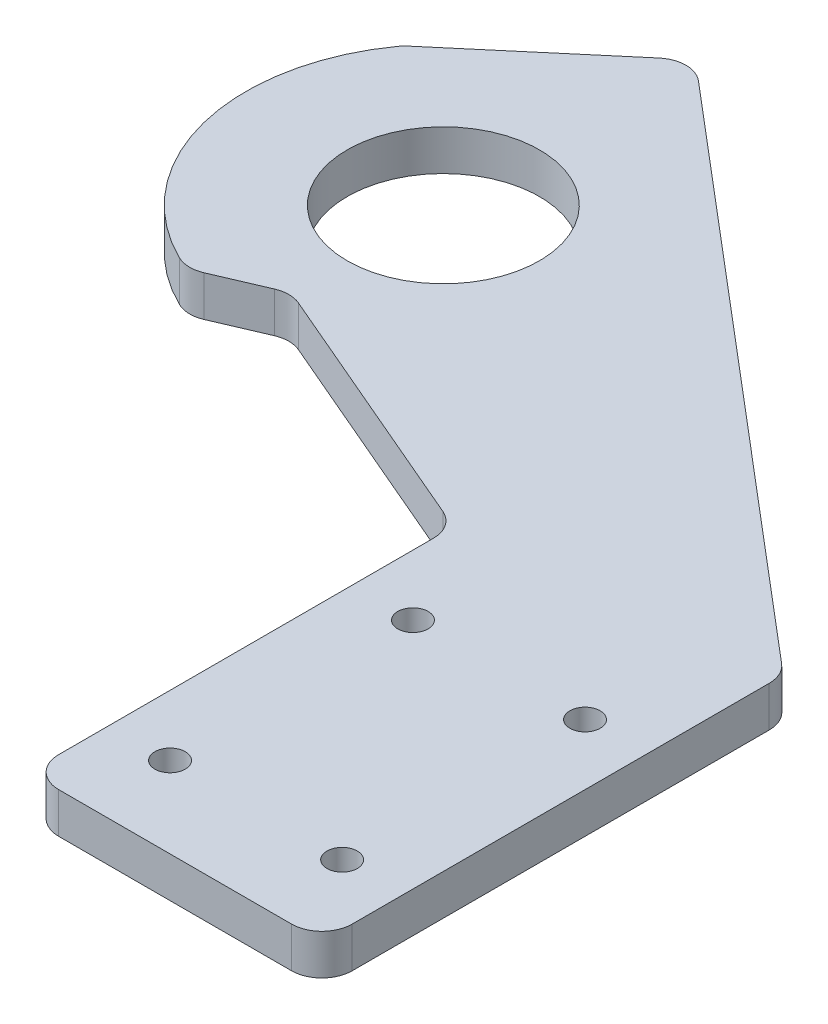
ISO-10303-21;
HEADER;
FILE_DESCRIPTION(('STEP AP214'),'2;1');
FILE_NAME('part.step','',(''),(''),'','','');
FILE_SCHEMA(('AUTOMOTIVE_DESIGN { 1 0 10303 214 1 1 1 1 }'));
ENDSEC;
DATA;
#1=APPLICATION_CONTEXT('core data for automotive mechanical design processes');
#2=APPLICATION_PROTOCOL_DEFINITION('international standard','automotive_design',2000,#1);
#3=PRODUCT_CONTEXT('',#1,'mechanical');
#4=PRODUCT('Part','Part','',(#3));
#5=PRODUCT_RELATED_PRODUCT_CATEGORY('part','',(#4));
#6=PRODUCT_DEFINITION_FORMATION('','',#4);
#7=PRODUCT_DEFINITION_CONTEXT('part definition',#1,'design');
#8=PRODUCT_DEFINITION('design','',#6,#7);
#9=PRODUCT_DEFINITION_SHAPE('','',#8);
#10=(LENGTH_UNIT() NAMED_UNIT(*) SI_UNIT(.MILLI.,.METRE.));
#11=(NAMED_UNIT(*) PLANE_ANGLE_UNIT() SI_UNIT($,.RADIAN.));
#12=(NAMED_UNIT(*) SI_UNIT($,.STERADIAN.) SOLID_ANGLE_UNIT());
#13=UNCERTAINTY_MEASURE_WITH_UNIT(LENGTH_MEASURE(1.E-05),#10,'distance_accuracy_value','');
#14=(GEOMETRIC_REPRESENTATION_CONTEXT(3) GLOBAL_UNCERTAINTY_ASSIGNED_CONTEXT((#13)) GLOBAL_UNIT_ASSIGNED_CONTEXT((#10,
#11,#12)) REPRESENTATION_CONTEXT('',''));
#15=CARTESIAN_POINT('',(0.,0.,0.));
#16=DIRECTION('',(0.,0.,1.));
#17=DIRECTION('',(1.,0.,0.));
#18=AXIS2_PLACEMENT_3D('',#15,#16,#17);
#19=CARTESIAN_POINT('',(12.,4.,-42.));
#20=DIRECTION('',(-0.393919298579168,0.,-0.919145030018058));
#21=DIRECTION('',(-0.919145030018058,0.,0.393919298579168));
#22=AXIS2_PLACEMENT_3D('',#19,#20,#21);
#23=PLANE('',#22);
#24=DIRECTION('',(0.919145030018058,0.,-0.393919298579168));
#25=VECTOR('',#24,1.);
#26=CARTESIAN_POINT('',(12.,4.,-42.));
#27=LINE('',#26,#25);
#28=CARTESIAN_POINT('',(33.9550810294325,4.,-51.4093204411854));
#29=VERTEX_POINT('',#28);
#30=CARTESIAN_POINT('',(38.8182421042625,4.,-53.4935323303982));
#31=VERTEX_POINT('',#30);
#32=EDGE_CURVE('E254',#29,#31,#27,.T.);
#33=ORIENTED_EDGE('',*,*,#32,.F.);
#34=DIRECTION('',(0.,-1.,0.));
#35=VECTOR('',#34,1.);
#36=CARTESIAN_POINT('',(33.9550810294325,0.,-51.4093204411854));
#37=LINE('',#36,#35);
#38=CARTESIAN_POINT('',(33.9550810294325,0.,-51.4093204411854));
#39=VERTEX_POINT('',#38);
#40=EDGE_CURVE('E202',#29,#39,#37,.T.);
#41=ORIENTED_EDGE('',*,*,#40,.T.);
#42=DIRECTION('',(0.919145030018058,0.,-0.393919298579168));
#43=VECTOR('',#42,1.);
#44=CARTESIAN_POINT('',(12.,0.,-42.));
#45=LINE('',#44,#43);
#46=CARTESIAN_POINT('',(38.8182421042625,0.,-53.4935323303982));
#47=VERTEX_POINT('',#46);
#48=EDGE_CURVE('E364',#39,#47,#45,.T.);
#49=ORIENTED_EDGE('',*,*,#48,.T.);
#50=DIRECTION('',(0.,-1.,0.));
#51=VECTOR('',#50,1.);
#52=CARTESIAN_POINT('',(38.8182421042625,4.,-53.4935323303982));
#53=LINE('',#52,#51);
#54=EDGE_CURVE('E196',#47,#31,#53,.F.);
#55=ORIENTED_EDGE('',*,*,#54,.T.);
#56=EDGE_LOOP('',(#33,#41,#49,#55));
#57=FACE_BOUND('',#56,.T.);
#58=ADVANCED_FACE('F43',(#57),#23,.F.);
#59=CARTESIAN_POINT('',(0.,4.,0.));
#60=DIRECTION('',(0.,-1.,0.));
#61=DIRECTION('',(0.,0.,-1.));
#62=AXIS2_PLACEMENT_3D('',#59,#60,#61);
#63=PLANE('',#62);
#64=CARTESIAN_POINT('',(40.,4.,-69.));
#65=DIRECTION('',(0.,1.,0.));
#66=DIRECTION('',(0.,0.,1.));
#67=AXIS2_PLACEMENT_3D('',#64,#65,#66);
#68=CIRCLE('',#67,19.5);
#69=CARTESIAN_POINT('',(24.1387597020295,4.,-80.343326505485));
#70=VERTEX_POINT('',#69);
#71=CARTESIAN_POINT('',(31.459381885276,4.,-51.4698019914649));
#72=VERTEX_POINT('',#71);
#73=EDGE_CURVE('E160',#70,#72,#68,.T.);
#74=ORIENTED_EDGE('',*,*,#73,.T.);
#75=CARTESIAN_POINT('',(32.773323133695,4.,-54.1667555312396));
#76=DIRECTION('',(0.,-1.,0.));
#77=DIRECTION('',(0.,0.,-1.));
#78=AXIS2_PLACEMENT_3D('',#75,#76,#77);
#79=CIRCLE('',#78,3.);
#80=EDGE_CURVE('E197',#72,#29,#79,.F.);
#81=ORIENTED_EDGE('',*,*,#80,.T.);
#82=ORIENTED_EDGE('',*,*,#32,.T.);
#83=CARTESIAN_POINT('',(40.,4.,-50.736097240344));
#84=DIRECTION('',(0.,-1.,0.));
#85=DIRECTION('',(0.,0.,-1.));
#86=AXIS2_PLACEMENT_3D('',#83,#84,#85);
#87=CIRCLE('',#86,3.);
#88=CARTESIAN_POINT('',(41.1817578957375,4.,-53.4935323303982));
#89=VERTEX_POINT('',#88);
#90=EDGE_CURVE('E244',#31,#89,#87,.T.);
#91=ORIENTED_EDGE('',*,*,#90,.T.);
#92=DIRECTION('',(0.919145030018058,0.,0.393919298579168));
#93=VECTOR('',#92,1.);
#94=CARTESIAN_POINT('',(40.,4.,-54.));
#95=LINE('',#94,#93);
#96=CARTESIAN_POINT('',(66.1817578957375,4.,-42.7792466161125));
#97=VERTEX_POINT('',#96);
#98=EDGE_CURVE('E249',#89,#97,#95,.T.);
#99=ORIENTED_EDGE('',*,*,#98,.T.);
#100=CARTESIAN_POINT('',(65.,4.,-40.0218115260583));
#101=DIRECTION('',(0.,-1.,0.));
#102=DIRECTION('',(0.,0.,-1.));
#103=AXIS2_PLACEMENT_3D('',#100,#101,#102);
#104=CIRCLE('',#103,3.);
#105=CARTESIAN_POINT('',(68.,4.,-40.0218115260583));
#106=VERTEX_POINT('',#105);
#107=EDGE_CURVE('E11',#97,#106,#104,.T.);
#108=ORIENTED_EDGE('',*,*,#107,.T.);
#109=DIRECTION('',(0.,0.,1.));
#110=VECTOR('',#109,1.);
#111=CARTESIAN_POINT('',(68.,4.,0.));
#112=LINE('',#111,#110);
#113=CARTESIAN_POINT('',(68.,4.,-3.00000000000001));
#114=VERTEX_POINT('',#113);
#115=EDGE_CURVE('E256',#106,#114,#112,.T.);
#116=ORIENTED_EDGE('',*,*,#115,.T.);
#117=CARTESIAN_POINT('',(71.,4.,-3.00000000000001));
#118=DIRECTION('',(0.,-1.,0.));
#119=DIRECTION('',(0.,0.,-1.));
#120=AXIS2_PLACEMENT_3D('',#117,#118,#119);
#121=CIRCLE('',#120,3.);
#122=CARTESIAN_POINT('',(71.,4.,0.));
#123=VERTEX_POINT('',#122);
#124=EDGE_CURVE('E198',#114,#123,#121,.F.);
#125=ORIENTED_EDGE('',*,*,#124,.T.);
#126=DIRECTION('',(1.,0.,0.));
#127=VECTOR('',#126,1.);
#128=CARTESIAN_POINT('',(80.,4.,0.));
#129=LINE('',#128,#127);
#130=CARTESIAN_POINT('',(94.,4.,0.));
#131=VERTEX_POINT('',#130);
#132=EDGE_CURVE('E369',#123,#131,#129,.T.);
#133=ORIENTED_EDGE('',*,*,#132,.T.);
#134=CARTESIAN_POINT('',(94.,4.,-3.00000000000001));
#135=DIRECTION('',(0.,-1.,0.));
#136=DIRECTION('',(0.,0.,-1.));
#137=AXIS2_PLACEMENT_3D('',#134,#135,#136);
#138=CIRCLE('',#137,3.);
#139=CARTESIAN_POINT('',(97.,4.,-3.00000000000001));
#140=VERTEX_POINT('',#139);
#141=EDGE_CURVE('E193',#131,#140,#138,.F.);
#142=ORIENTED_EDGE('',*,*,#141,.T.);
#143=DIRECTION('',(0.,0.,1.));
#144=VECTOR('',#143,1.);
#145=CARTESIAN_POINT('',(97.,4.,0.));
#146=LINE('',#145,#144);
#147=CARTESIAN_POINT('',(97.,4.,-44.1992926229382));
#148=VERTEX_POINT('',#147);
#149=EDGE_CURVE('E407',#148,#140,#146,.T.);
#150=ORIENTED_EDGE('',*,*,#149,.F.);
#151=CARTESIAN_POINT('',(94.,4.,-44.1992926229382));
#152=DIRECTION('',(0.,-1.,0.));
#153=DIRECTION('',(0.,0.,-1.));
#154=AXIS2_PLACEMENT_3D('',#151,#152,#153);
#155=CIRCLE('',#154,3.);
#156=CARTESIAN_POINT('',(95.9398921562924,4.,-46.4877022064601));
#157=VERTEX_POINT('',#156);
#158=EDGE_CURVE('E166',#148,#157,#155,.F.);
#159=ORIENTED_EDGE('',*,*,#158,.T.);
#160=DIRECTION('',(-0.762803194507315,0.,-0.646630718764146));
#161=VECTOR('',#160,1.);
#162=CARTESIAN_POINT('',(40.,4.,-93.9081285144222));
#163=LINE('',#162,#161);
#164=CARTESIAN_POINT('',(41.9398921562924,4.,-92.2636757009301));
#165=VERTEX_POINT('',#164);
#166=EDGE_CURVE('E187',#157,#165,#163,.T.);
#167=ORIENTED_EDGE('',*,*,#166,.T.);
#168=CARTESIAN_POINT('',(40.,4.,-89.9752661174082));
#169=DIRECTION('',(0.,-1.,0.));
#170=DIRECTION('',(0.,0.,-1.));
#171=AXIS2_PLACEMENT_3D('',#168,#169,#170);
#172=CIRCLE('',#171,3.);
#173=CARTESIAN_POINT('',(38.0601078437076,4.,-92.2636757009301));
#174=VERTEX_POINT('',#173);
#175=EDGE_CURVE('E170',#165,#174,#172,.F.);
#176=ORIENTED_EDGE('',*,*,#175,.T.);
#177=DIRECTION('',(-0.762803194507315,0.,0.646630718764146));
#178=VECTOR('',#177,1.);
#179=CARTESIAN_POINT('',(0.,4.,-60.));
#180=LINE('',#179,#178);
#181=CARTESIAN_POINT('',(24.6390583608095,4.,-80.8866089343169));
#182=VERTEX_POINT('',#181);
#183=EDGE_CURVE('E162',#174,#182,#180,.T.);
#184=ORIENTED_EDGE('',*,*,#183,.T.);
#185=CARTESIAN_POINT('',(26.5789505171019,4.,-78.598199350795));
#186=DIRECTION('',(0.,-1.,0.));
#187=DIRECTION('',(0.,0.,-1.));
#188=AXIS2_PLACEMENT_3D('',#185,#186,#187);
#189=CIRCLE('',#188,3.);
#190=EDGE_CURVE('E156',#182,#70,#189,.F.);
#191=ORIENTED_EDGE('',*,*,#190,.T.);
#192=EDGE_LOOP('',(#74,#81,#82,#91,#99,#108,#116,#125,#133,#142,#150,#159,#167,#176,#184,#191));
#193=FACE_BOUND('',#192,.T.);
#194=CARTESIAN_POINT('',(74.,4.,-8.));
#195=DIRECTION('',(0.,1.,0.));
#196=DIRECTION('',(0.,0.,-1.));
#197=AXIS2_PLACEMENT_3D('',#194,#195,#196);
#198=CIRCLE('',#197,1.50000000000001);
#199=CARTESIAN_POINT('',(74.,4.,-9.50000000000001));
#200=VERTEX_POINT('',#199);
#201=EDGE_CURVE('E363',#200,#200,#198,.T.);
#202=ORIENTED_EDGE('',*,*,#201,.F.);
#203=EDGE_LOOP('',(#202));
#204=FACE_BOUND('',#203,.T.);
#205=CARTESIAN_POINT('',(40.,4.,-69.));
#206=DIRECTION('',(0.,1.,0.));
#207=DIRECTION('',(0.,0.,1.));
#208=AXIS2_PLACEMENT_3D('',#205,#206,#207);
#209=CIRCLE('',#208,9.50000000000001);
#210=CARTESIAN_POINT('',(40.,4.,-59.5));
#211=VERTEX_POINT('',#210);
#212=EDGE_CURVE('E355',#211,#211,#209,.T.);
#213=ORIENTED_EDGE('',*,*,#212,.F.);
#214=EDGE_LOOP('',(#213));
#215=FACE_BOUND('',#214,.T.);
#216=CARTESIAN_POINT('',(74.,4.,-32.));
#217=DIRECTION('',(0.,1.,0.));
#218=DIRECTION('',(0.,0.,-1.));
#219=AXIS2_PLACEMENT_3D('',#216,#217,#218);
#220=CIRCLE('',#219,1.50000000000001);
#221=CARTESIAN_POINT('',(74.,4.,-33.5));
#222=VERTEX_POINT('',#221);
#223=EDGE_CURVE('E350',#222,#222,#220,.T.);
#224=ORIENTED_EDGE('',*,*,#223,.F.);
#225=EDGE_LOOP('',(#224));
#226=FACE_BOUND('',#225,.T.);
#227=CARTESIAN_POINT('',(91.,4.,-8.));
#228=DIRECTION('',(0.,1.,0.));
#229=DIRECTION('',(0.,0.,1.));
#230=AXIS2_PLACEMENT_3D('',#227,#228,#229);
#231=CIRCLE('',#230,1.50000000000001);
#232=CARTESIAN_POINT('',(91.,4.,-6.49999999999999));
#233=VERTEX_POINT('',#232);
#234=EDGE_CURVE('E345',#233,#233,#231,.T.);
#235=ORIENTED_EDGE('',*,*,#234,.F.);
#236=EDGE_LOOP('',(#235));
#237=FACE_BOUND('',#236,.T.);
#238=CARTESIAN_POINT('',(91.,4.,-32.));
#239=DIRECTION('',(0.,1.,0.));
#240=DIRECTION('',(0.,0.,1.));
#241=AXIS2_PLACEMENT_3D('',#238,#239,#240);
#242=CIRCLE('',#241,1.50000000000001);
#243=CARTESIAN_POINT('',(91.,4.,-30.5));
#244=VERTEX_POINT('',#243);
#245=EDGE_CURVE('E332',#244,#244,#242,.T.);
#246=ORIENTED_EDGE('',*,*,#245,.F.);
#247=EDGE_LOOP('',(#246));
#248=FACE_BOUND('',#247,.T.);
#249=ADVANCED_FACE('F159',(#193,#204,#215,#226,#237,#248),#63,.F.);
#250=CARTESIAN_POINT('',(0.,0.,0.));
#251=DIRECTION('',(0.,-1.,0.));
#252=DIRECTION('',(0.,0.,-1.));
#253=AXIS2_PLACEMENT_3D('',#250,#251,#252);
#254=PLANE('',#253);
#255=ORIENTED_EDGE('',*,*,#48,.F.);
#256=CARTESIAN_POINT('',(32.773323133695,0.,-54.1667555312396));
#257=DIRECTION('',(0.,-1.,0.));
#258=DIRECTION('',(0.,0.,-1.));
#259=AXIS2_PLACEMENT_3D('',#256,#257,#258);
#260=CIRCLE('',#259,3.);
#261=CARTESIAN_POINT('',(31.459381885276,0.,-51.4698019914649));
#262=VERTEX_POINT('',#261);
#263=EDGE_CURVE('E215',#39,#262,#260,.T.);
#264=ORIENTED_EDGE('',*,*,#263,.T.);
#265=CARTESIAN_POINT('',(40.,0.,-69.));
#266=DIRECTION('',(0.,1.,0.));
#267=DIRECTION('',(0.,0.,1.));
#268=AXIS2_PLACEMENT_3D('',#265,#266,#267);
#269=CIRCLE('',#268,19.5);
#270=CARTESIAN_POINT('',(24.1387597020295,0.,-80.343326505485));
#271=VERTEX_POINT('',#270);
#272=EDGE_CURVE('E178',#271,#262,#269,.T.);
#273=ORIENTED_EDGE('',*,*,#272,.F.);
#274=CARTESIAN_POINT('',(26.5789505171019,0.,-78.598199350795));
#275=DIRECTION('',(0.,-1.,0.));
#276=DIRECTION('',(0.,0.,-1.));
#277=AXIS2_PLACEMENT_3D('',#274,#275,#276);
#278=CIRCLE('',#277,3.);
#279=CARTESIAN_POINT('',(24.6390583608095,0.,-80.8866089343169));
#280=VERTEX_POINT('',#279);
#281=EDGE_CURVE('E182',#271,#280,#278,.T.);
#282=ORIENTED_EDGE('',*,*,#281,.T.);
#283=DIRECTION('',(-0.762803194507315,0.,0.646630718764146));
#284=VECTOR('',#283,1.);
#285=CARTESIAN_POINT('',(0.,0.,-60.));
#286=LINE('',#285,#284);
#287=CARTESIAN_POINT('',(38.0601078437076,0.,-92.2636757009301));
#288=VERTEX_POINT('',#287);
#289=EDGE_CURVE('E186',#288,#280,#286,.T.);
#290=ORIENTED_EDGE('',*,*,#289,.F.);
#291=CARTESIAN_POINT('',(40.,0.,-89.9752661174082));
#292=DIRECTION('',(0.,-1.,0.));
#293=DIRECTION('',(0.,0.,-1.));
#294=AXIS2_PLACEMENT_3D('',#291,#292,#293);
#295=CIRCLE('',#294,3.);
#296=CARTESIAN_POINT('',(41.9398921562924,0.,-92.2636757009301));
#297=VERTEX_POINT('',#296);
#298=EDGE_CURVE('E210',#288,#297,#295,.T.);
#299=ORIENTED_EDGE('',*,*,#298,.T.);
#300=DIRECTION('',(-0.762803194507315,0.,-0.646630718764146));
#301=VECTOR('',#300,1.);
#302=CARTESIAN_POINT('',(40.,0.,-93.9081285144222));
#303=LINE('',#302,#301);
#304=CARTESIAN_POINT('',(95.9398921562924,0.,-46.4877022064601));
#305=VERTEX_POINT('',#304);
#306=EDGE_CURVE('E381',#305,#297,#303,.T.);
#307=ORIENTED_EDGE('',*,*,#306,.F.);
#308=CARTESIAN_POINT('',(94.,0.,-44.1992926229382));
#309=DIRECTION('',(0.,-1.,0.));
#310=DIRECTION('',(0.,0.,-1.));
#311=AXIS2_PLACEMENT_3D('',#308,#309,#310);
#312=CIRCLE('',#311,3.);
#313=CARTESIAN_POINT('',(97.,0.,-44.1992926229382));
#314=VERTEX_POINT('',#313);
#315=EDGE_CURVE('E203',#305,#314,#312,.T.);
#316=ORIENTED_EDGE('',*,*,#315,.T.);
#317=DIRECTION('',(0.,0.,1.));
#318=VECTOR('',#317,1.);
#319=CARTESIAN_POINT('',(97.,0.,0.));
#320=LINE('',#319,#318);
#321=CARTESIAN_POINT('',(97.,0.,-3.00000000000001));
#322=VERTEX_POINT('',#321);
#323=EDGE_CURVE('E337',#314,#322,#320,.T.);
#324=ORIENTED_EDGE('',*,*,#323,.T.);
#325=CARTESIAN_POINT('',(94.,0.,-3.00000000000001));
#326=DIRECTION('',(0.,-1.,0.));
#327=DIRECTION('',(0.,0.,-1.));
#328=AXIS2_PLACEMENT_3D('',#325,#326,#327);
#329=CIRCLE('',#328,3.);
#330=CARTESIAN_POINT('',(94.,0.,0.));
#331=VERTEX_POINT('',#330);
#332=EDGE_CURVE('E209',#322,#331,#329,.T.);
#333=ORIENTED_EDGE('',*,*,#332,.T.);
#334=DIRECTION('',(1.,0.,0.));
#335=VECTOR('',#334,1.);
#336=CARTESIAN_POINT('',(80.,0.,0.));
#337=LINE('',#336,#335);
#338=CARTESIAN_POINT('',(71.,0.,0.));
#339=VERTEX_POINT('',#338);
#340=EDGE_CURVE('E385',#339,#331,#337,.T.);
#341=ORIENTED_EDGE('',*,*,#340,.F.);
#342=CARTESIAN_POINT('',(71.,0.,-3.00000000000001));
#343=DIRECTION('',(0.,-1.,0.));
#344=DIRECTION('',(0.,0.,-1.));
#345=AXIS2_PLACEMENT_3D('',#342,#343,#344);
#346=CIRCLE('',#345,3.);
#347=CARTESIAN_POINT('',(68.,0.,-3.00000000000001));
#348=VERTEX_POINT('',#347);
#349=EDGE_CURVE('E214',#339,#348,#346,.T.);
#350=ORIENTED_EDGE('',*,*,#349,.T.);
#351=DIRECTION('',(0.,0.,1.));
#352=VECTOR('',#351,1.);
#353=CARTESIAN_POINT('',(68.,0.,0.));
#354=LINE('',#353,#352);
#355=CARTESIAN_POINT('',(68.,0.,-40.0218115260583));
#356=VERTEX_POINT('',#355);
#357=EDGE_CURVE('E378',#356,#348,#354,.T.);
#358=ORIENTED_EDGE('',*,*,#357,.F.);
#359=CARTESIAN_POINT('',(65.,0.,-40.0218115260583));
#360=DIRECTION('',(0.,-1.,0.));
#361=DIRECTION('',(0.,0.,-1.));
#362=AXIS2_PLACEMENT_3D('',#359,#360,#361);
#363=CIRCLE('',#362,3.);
#364=CARTESIAN_POINT('',(66.1817578957375,0.,-42.7792466161125));
#365=VERTEX_POINT('',#364);
#366=EDGE_CURVE('E51',#356,#365,#363,.F.);
#367=ORIENTED_EDGE('',*,*,#366,.T.);
#368=DIRECTION('',(0.919145030018058,0.,0.393919298579168));
#369=VECTOR('',#368,1.);
#370=CARTESIAN_POINT('',(40.,0.,-54.));
#371=LINE('',#370,#369);
#372=CARTESIAN_POINT('',(41.1817578957375,0.,-53.4935323303982));
#373=VERTEX_POINT('',#372);
#374=EDGE_CURVE('E380',#373,#365,#371,.T.);
#375=ORIENTED_EDGE('',*,*,#374,.F.);
#376=CARTESIAN_POINT('',(40.,0.,-50.736097240344));
#377=DIRECTION('',(0.,-1.,0.));
#378=DIRECTION('',(0.,0.,-1.));
#379=AXIS2_PLACEMENT_3D('',#376,#377,#378);
#380=CIRCLE('',#379,3.);
#381=EDGE_CURVE('E62',#373,#47,#380,.F.);
#382=ORIENTED_EDGE('',*,*,#381,.T.);
#383=EDGE_LOOP('',(#255,#264,#273,#282,#290,#299,#307,#316,#324,#333,#341,#350,#358,#367,#375,#382));
#384=FACE_BOUND('',#383,.T.);
#385=CARTESIAN_POINT('',(40.,0.,-69.));
#386=DIRECTION('',(0.,1.,0.));
#387=DIRECTION('',(0.,0.,1.));
#388=AXIS2_PLACEMENT_3D('',#385,#386,#387);
#389=CIRCLE('',#388,9.50000000000001);
#390=CARTESIAN_POINT('',(40.,0.,-59.5));
#391=VERTEX_POINT('',#390);
#392=EDGE_CURVE('E352',#391,#391,#389,.T.);
#393=ORIENTED_EDGE('',*,*,#392,.T.);
#394=EDGE_LOOP('',(#393));
#395=FACE_BOUND('',#394,.T.);
#396=CARTESIAN_POINT('',(74.,0.,-8.));
#397=DIRECTION('',(0.,1.,0.));
#398=DIRECTION('',(0.,0.,-1.));
#399=AXIS2_PLACEMENT_3D('',#396,#397,#398);
#400=CIRCLE('',#399,1.50000000000001);
#401=CARTESIAN_POINT('',(74.,0.,-9.50000000000001));
#402=VERTEX_POINT('',#401);
#403=EDGE_CURVE('E356',#402,#402,#400,.T.);
#404=ORIENTED_EDGE('',*,*,#403,.T.);
#405=EDGE_LOOP('',(#404));
#406=FACE_BOUND('',#405,.T.);
#407=CARTESIAN_POINT('',(74.,0.,-32.));
#408=DIRECTION('',(0.,1.,0.));
#409=DIRECTION('',(0.,0.,-1.));
#410=AXIS2_PLACEMENT_3D('',#407,#408,#409);
#411=CIRCLE('',#410,1.50000000000001);
#412=CARTESIAN_POINT('',(74.,0.,-33.5));
#413=VERTEX_POINT('',#412);
#414=EDGE_CURVE('E349',#413,#413,#411,.T.);
#415=ORIENTED_EDGE('',*,*,#414,.T.);
#416=EDGE_LOOP('',(#415));
#417=FACE_BOUND('',#416,.T.);
#418=CARTESIAN_POINT('',(91.,0.,-8.));
#419=DIRECTION('',(0.,-1.,0.));
#420=DIRECTION('',(0.,0.,-1.));
#421=AXIS2_PLACEMENT_3D('',#418,#419,#420);
#422=CIRCLE('',#421,1.50000000000001);
#423=CARTESIAN_POINT('',(91.,0.,-9.50000000000001));
#424=VERTEX_POINT('',#423);
#425=EDGE_CURVE('E339',#424,#424,#422,.F.);
#426=ORIENTED_EDGE('',*,*,#425,.T.);
#427=EDGE_LOOP('',(#426));
#428=FACE_BOUND('',#427,.T.);
#429=CARTESIAN_POINT('',(91.,0.,-32.));
#430=DIRECTION('',(0.,-1.,0.));
#431=DIRECTION('',(0.,0.,-1.));
#432=AXIS2_PLACEMENT_3D('',#429,#430,#431);
#433=CIRCLE('',#432,1.50000000000001);
#434=CARTESIAN_POINT('',(91.,0.,-33.5));
#435=VERTEX_POINT('',#434);
#436=EDGE_CURVE('E177',#435,#435,#433,.F.);
#437=ORIENTED_EDGE('',*,*,#436,.T.);
#438=EDGE_LOOP('',(#437));
#439=FACE_BOUND('',#438,.T.);
#440=ADVANCED_FACE('F283',(#384,#395,#406,#417,#428,#439),#254,.T.);
#441=CARTESIAN_POINT('',(40.,4.,-54.));
#442=DIRECTION('',(0.393919298579168,0.,-0.919145030018058));
#443=DIRECTION('',(-0.919145030018058,0.,-0.393919298579168));
#444=AXIS2_PLACEMENT_3D('',#441,#442,#443);
#445=PLANE('',#444);
#446=ORIENTED_EDGE('',*,*,#98,.F.);
#447=DIRECTION('',(0.,-1.,0.));
#448=VECTOR('',#447,1.);
#449=CARTESIAN_POINT('',(41.1817578957375,0.,-53.4935323303982));
#450=LINE('',#449,#448);
#451=EDGE_CURVE('E219',#89,#373,#450,.T.);
#452=ORIENTED_EDGE('',*,*,#451,.T.);
#453=ORIENTED_EDGE('',*,*,#374,.T.);
#454=DIRECTION('',(0.,-1.,0.));
#455=VECTOR('',#454,1.);
#456=CARTESIAN_POINT('',(66.1817578957375,4.,-42.7792466161125));
#457=LINE('',#456,#455);
#458=EDGE_CURVE('E212',#365,#97,#457,.F.);
#459=ORIENTED_EDGE('',*,*,#458,.T.);
#460=EDGE_LOOP('',(#446,#452,#453,#459));
#461=FACE_BOUND('',#460,.T.);
#462=ADVANCED_FACE('F253',(#461),#445,.F.);
#463=CARTESIAN_POINT('',(68.,4.,0.));
#464=DIRECTION('',(1.,0.,0.));
#465=DIRECTION('',(0.,0.,-1.));
#466=AXIS2_PLACEMENT_3D('',#463,#464,#465);
#467=PLANE('',#466);
#468=ORIENTED_EDGE('',*,*,#115,.F.);
#469=DIRECTION('',(0.,-1.,0.));
#470=VECTOR('',#469,1.);
#471=CARTESIAN_POINT('',(68.,0.,-40.0218115260583));
#472=LINE('',#471,#470);
#473=EDGE_CURVE('E221',#106,#356,#472,.T.);
#474=ORIENTED_EDGE('',*,*,#473,.T.);
#475=ORIENTED_EDGE('',*,*,#357,.T.);
#476=DIRECTION('',(0.,-1.,0.));
#477=VECTOR('',#476,1.);
#478=CARTESIAN_POINT('',(68.,4.,-3.00000000000001));
#479=LINE('',#478,#477);
#480=EDGE_CURVE('E220',#348,#114,#479,.F.);
#481=ORIENTED_EDGE('',*,*,#480,.T.);
#482=EDGE_LOOP('',(#468,#474,#475,#481));
#483=FACE_BOUND('',#482,.T.);
#484=ADVANCED_FACE('F286',(#483),#467,.F.);
#485=CARTESIAN_POINT('',(80.,4.,0.));
#486=DIRECTION('',(0.,0.,-1.));
#487=DIRECTION('',(-1.,0.,0.));
#488=AXIS2_PLACEMENT_3D('',#485,#486,#487);
#489=PLANE('',#488);
#490=ORIENTED_EDGE('',*,*,#132,.F.);
#491=DIRECTION('',(0.,-1.,0.));
#492=VECTOR('',#491,1.);
#493=CARTESIAN_POINT('',(71.,4.,0.));
#494=LINE('',#493,#492);
#495=EDGE_CURVE('E227',#123,#339,#494,.T.);
#496=ORIENTED_EDGE('',*,*,#495,.T.);
#497=ORIENTED_EDGE('',*,*,#340,.T.);
#498=DIRECTION('',(0.,1.,0.));
#499=VECTOR('',#498,1.);
#500=CARTESIAN_POINT('',(94.,4.,0.));
#501=LINE('',#500,#499);
#502=EDGE_CURVE('E223',#331,#131,#501,.T.);
#503=ORIENTED_EDGE('',*,*,#502,.T.);
#504=EDGE_LOOP('',(#490,#496,#497,#503));
#505=FACE_BOUND('',#504,.T.);
#506=ADVANCED_FACE('F288',(#505),#489,.F.);
#507=CARTESIAN_POINT('',(40.,4.,-93.9081285144222));
#508=DIRECTION('',(-0.646630718764146,0.,0.762803194507315));
#509=DIRECTION('',(0.762803194507315,0.,0.646630718764146));
#510=AXIS2_PLACEMENT_3D('',#507,#508,#509);
#511=PLANE('',#510);
#512=ORIENTED_EDGE('',*,*,#306,.T.);
#513=DIRECTION('',(0.,-1.,0.));
#514=VECTOR('',#513,1.);
#515=CARTESIAN_POINT('',(41.9398921562924,4.,-92.2636757009301));
#516=LINE('',#515,#514);
#517=EDGE_CURVE('E245',#297,#165,#516,.F.);
#518=ORIENTED_EDGE('',*,*,#517,.T.);
#519=ORIENTED_EDGE('',*,*,#166,.F.);
#520=DIRECTION('',(0.,1.,0.));
#521=VECTOR('',#520,1.);
#522=CARTESIAN_POINT('',(95.9398921562924,4.,-46.4877022064601));
#523=LINE('',#522,#521);
#524=EDGE_CURVE('E239',#157,#305,#523,.F.);
#525=ORIENTED_EDGE('',*,*,#524,.T.);
#526=EDGE_LOOP('',(#512,#518,#519,#525));
#527=FACE_BOUND('',#526,.T.);
#528=ADVANCED_FACE('F291',(#527),#511,.F.);
#529=CARTESIAN_POINT('',(0.,4.,-60.));
#530=DIRECTION('',(0.646630718764146,0.,0.762803194507315));
#531=DIRECTION('',(0.762803194507315,0.,-0.646630718764146));
#532=AXIS2_PLACEMENT_3D('',#529,#530,#531);
#533=PLANE('',#532);
#534=ORIENTED_EDGE('',*,*,#183,.F.);
#535=DIRECTION('',(0.,-1.,0.));
#536=VECTOR('',#535,1.);
#537=CARTESIAN_POINT('',(38.0601078437076,4.,-92.2636757009301));
#538=LINE('',#537,#536);
#539=EDGE_CURVE('E240',#174,#288,#538,.T.);
#540=ORIENTED_EDGE('',*,*,#539,.T.);
#541=ORIENTED_EDGE('',*,*,#289,.T.);
#542=DIRECTION('',(0.,-1.,0.));
#543=VECTOR('',#542,1.);
#544=CARTESIAN_POINT('',(24.6390583608095,4.,-80.8866089343169));
#545=LINE('',#544,#543);
#546=EDGE_CURVE('E232',#280,#182,#545,.F.);
#547=ORIENTED_EDGE('',*,*,#546,.T.);
#548=EDGE_LOOP('',(#534,#540,#541,#547));
#549=FACE_BOUND('',#548,.T.);
#550=ADVANCED_FACE('F300',(#549),#533,.F.);
#551=CARTESIAN_POINT('',(74.,4.,-8.));
#552=DIRECTION('',(0.,-1.,0.));
#553=DIRECTION('',(0.,0.,-1.));
#554=AXIS2_PLACEMENT_3D('',#551,#552,#553);
#555=CYLINDRICAL_SURFACE('',#554,1.50000000000001);
#556=ORIENTED_EDGE('',*,*,#201,.T.);
#557=EDGE_LOOP('',(#556));
#558=FACE_BOUND('',#557,.T.);
#559=ORIENTED_EDGE('',*,*,#403,.F.);
#560=EDGE_LOOP('',(#559));
#561=FACE_BOUND('',#560,.T.);
#562=ADVANCED_FACE('F301',(#558,#561),#555,.F.);
#563=CARTESIAN_POINT('',(40.,4.,-69.));
#564=DIRECTION('',(0.,-1.,0.));
#565=DIRECTION('',(0.,0.,-1.));
#566=AXIS2_PLACEMENT_3D('',#563,#564,#565);
#567=CYLINDRICAL_SURFACE('',#566,9.50000000000001);
#568=ORIENTED_EDGE('',*,*,#212,.T.);
#569=EDGE_LOOP('',(#568));
#570=FACE_BOUND('',#569,.T.);
#571=ORIENTED_EDGE('',*,*,#392,.F.);
#572=EDGE_LOOP('',(#571));
#573=FACE_BOUND('',#572,.T.);
#574=ADVANCED_FACE('F310',(#570,#573),#567,.F.);
#575=CARTESIAN_POINT('',(74.,4.,-32.));
#576=DIRECTION('',(0.,-1.,0.));
#577=DIRECTION('',(0.,0.,-1.));
#578=AXIS2_PLACEMENT_3D('',#575,#576,#577);
#579=CYLINDRICAL_SURFACE('',#578,1.50000000000001);
#580=ORIENTED_EDGE('',*,*,#223,.T.);
#581=EDGE_LOOP('',(#580));
#582=FACE_BOUND('',#581,.T.);
#583=ORIENTED_EDGE('',*,*,#414,.F.);
#584=EDGE_LOOP('',(#583));
#585=FACE_BOUND('',#584,.T.);
#586=ADVANCED_FACE('F311',(#582,#585),#579,.F.);
#587=CARTESIAN_POINT('',(40.,0.,-69.));
#588=DIRECTION('',(0.,1.,0.));
#589=DIRECTION('',(0.,0.,1.));
#590=AXIS2_PLACEMENT_3D('',#587,#588,#589);
#591=CYLINDRICAL_SURFACE('',#590,19.5);
#592=ORIENTED_EDGE('',*,*,#272,.T.);
#593=DIRECTION('',(0.,1.,0.));
#594=VECTOR('',#593,1.);
#595=CARTESIAN_POINT('',(31.459381885276,0.,-51.4698019914649));
#596=LINE('',#595,#594);
#597=EDGE_CURVE('E180',#262,#72,#596,.T.);
#598=ORIENTED_EDGE('',*,*,#597,.T.);
#599=ORIENTED_EDGE('',*,*,#73,.F.);
#600=DIRECTION('',(0.,1.,0.));
#601=VECTOR('',#600,1.);
#602=CARTESIAN_POINT('',(24.1387597020295,0.,-80.343326505485));
#603=LINE('',#602,#601);
#604=EDGE_CURVE('E172',#70,#271,#603,.F.);
#605=ORIENTED_EDGE('',*,*,#604,.T.);
#606=EDGE_LOOP('',(#592,#598,#599,#605));
#607=FACE_BOUND('',#606,.T.);
#608=ADVANCED_FACE('F173',(#607),#591,.T.);
#609=CARTESIAN_POINT('',(97.,-62.3618473106754,0.));
#610=DIRECTION('',(-1.,0.,0.));
#611=DIRECTION('',(0.,0.,1.));
#612=AXIS2_PLACEMENT_3D('',#609,#610,#611);
#613=PLANE('',#612);
#614=ORIENTED_EDGE('',*,*,#149,.T.);
#615=DIRECTION('',(0.,1.,0.));
#616=VECTOR('',#615,1.);
#617=CARTESIAN_POINT('',(97.,-62.3618473106754,-3.00000000000001));
#618=LINE('',#617,#616);
#619=EDGE_CURVE('E231',#140,#322,#618,.F.);
#620=ORIENTED_EDGE('',*,*,#619,.T.);
#621=ORIENTED_EDGE('',*,*,#323,.F.);
#622=DIRECTION('',(0.,1.,0.));
#623=VECTOR('',#622,1.);
#624=CARTESIAN_POINT('',(97.,-62.3618473106754,-44.1992926229382));
#625=LINE('',#624,#623);
#626=EDGE_CURVE('E229',#314,#148,#625,.T.);
#627=ORIENTED_EDGE('',*,*,#626,.T.);
#628=EDGE_LOOP('',(#614,#620,#621,#627));
#629=FACE_BOUND('',#628,.T.);
#630=ADVANCED_FACE('F319',(#629),#613,.F.);
#631=CARTESIAN_POINT('',(91.,-62.3618473106754,-32.));
#632=DIRECTION('',(0.,1.,0.));
#633=DIRECTION('',(0.,0.,1.));
#634=AXIS2_PLACEMENT_3D('',#631,#632,#633);
#635=CYLINDRICAL_SURFACE('',#634,1.50000000000001);
#636=ORIENTED_EDGE('',*,*,#245,.T.);
#637=EDGE_LOOP('',(#636));
#638=FACE_BOUND('',#637,.T.);
#639=ORIENTED_EDGE('',*,*,#436,.F.);
#640=EDGE_LOOP('',(#639));
#641=FACE_BOUND('',#640,.T.);
#642=ADVANCED_FACE('F324',(#638,#641),#635,.F.);
#643=CARTESIAN_POINT('',(91.,-62.3618473106754,-8.));
#644=DIRECTION('',(0.,1.,0.));
#645=DIRECTION('',(0.,0.,1.));
#646=AXIS2_PLACEMENT_3D('',#643,#644,#645);
#647=CYLINDRICAL_SURFACE('',#646,1.50000000000001);
#648=ORIENTED_EDGE('',*,*,#234,.T.);
#649=EDGE_LOOP('',(#648));
#650=FACE_BOUND('',#649,.T.);
#651=ORIENTED_EDGE('',*,*,#425,.F.);
#652=EDGE_LOOP('',(#651));
#653=FACE_BOUND('',#652,.T.);
#654=ADVANCED_FACE('F272',(#650,#653),#647,.F.);
#655=CARTESIAN_POINT('',(32.773323133695,0.,-54.1667555312396));
#656=DIRECTION('',(0.,1.,0.));
#657=DIRECTION('',(0.,0.,1.));
#658=AXIS2_PLACEMENT_3D('',#655,#656,#657);
#659=CYLINDRICAL_SURFACE('',#658,3.);
#660=ORIENTED_EDGE('',*,*,#263,.F.);
#661=ORIENTED_EDGE('',*,*,#40,.F.);
#662=ORIENTED_EDGE('',*,*,#80,.F.);
#663=ORIENTED_EDGE('',*,*,#597,.F.);
#664=EDGE_LOOP('',(#660,#661,#662,#663));
#665=FACE_BOUND('',#664,.T.);
#666=ADVANCED_FACE('F264',(#665),#659,.T.);
#667=CARTESIAN_POINT('',(40.,4.,-50.736097240344));
#668=DIRECTION('',(0.,1.,0.));
#669=DIRECTION('',(0.,0.,1.));
#670=AXIS2_PLACEMENT_3D('',#667,#668,#669);
#671=CYLINDRICAL_SURFACE('',#670,3.);
#672=ORIENTED_EDGE('',*,*,#90,.F.);
#673=ORIENTED_EDGE('',*,*,#54,.F.);
#674=ORIENTED_EDGE('',*,*,#381,.F.);
#675=ORIENTED_EDGE('',*,*,#451,.F.);
#676=EDGE_LOOP('',(#672,#673,#674,#675));
#677=FACE_BOUND('',#676,.T.);
#678=ADVANCED_FACE('F258',(#677),#671,.F.);
#679=CARTESIAN_POINT('',(65.,4.,-40.0218115260583));
#680=DIRECTION('',(0.,1.,0.));
#681=DIRECTION('',(0.,0.,1.));
#682=AXIS2_PLACEMENT_3D('',#679,#680,#681);
#683=CYLINDRICAL_SURFACE('',#682,3.);
#684=ORIENTED_EDGE('',*,*,#107,.F.);
#685=ORIENTED_EDGE('',*,*,#458,.F.);
#686=ORIENTED_EDGE('',*,*,#366,.F.);
#687=ORIENTED_EDGE('',*,*,#473,.F.);
#688=EDGE_LOOP('',(#684,#685,#686,#687));
#689=FACE_BOUND('',#688,.T.);
#690=ADVANCED_FACE('F263',(#689),#683,.F.);
#691=CARTESIAN_POINT('',(71.,4.,-3.00000000000001));
#692=DIRECTION('',(0.,-1.,0.));
#693=DIRECTION('',(0.,0.,-1.));
#694=AXIS2_PLACEMENT_3D('',#691,#692,#693);
#695=CYLINDRICAL_SURFACE('',#694,3.);
#696=ORIENTED_EDGE('',*,*,#124,.F.);
#697=ORIENTED_EDGE('',*,*,#480,.F.);
#698=ORIENTED_EDGE('',*,*,#349,.F.);
#699=ORIENTED_EDGE('',*,*,#495,.F.);
#700=EDGE_LOOP('',(#696,#697,#698,#699));
#701=FACE_BOUND('',#700,.T.);
#702=ADVANCED_FACE('F269',(#701),#695,.T.);
#703=CARTESIAN_POINT('',(94.,4.,-3.00000000000001));
#704=DIRECTION('',(0.,1.,0.));
#705=DIRECTION('',(0.,0.,1.));
#706=AXIS2_PLACEMENT_3D('',#703,#704,#705);
#707=CYLINDRICAL_SURFACE('',#706,3.);
#708=ORIENTED_EDGE('',*,*,#332,.F.);
#709=ORIENTED_EDGE('',*,*,#619,.F.);
#710=ORIENTED_EDGE('',*,*,#141,.F.);
#711=ORIENTED_EDGE('',*,*,#502,.F.);
#712=EDGE_LOOP('',(#708,#709,#710,#711));
#713=FACE_BOUND('',#712,.T.);
#714=ADVANCED_FACE('F409',(#713),#707,.T.);
#715=CARTESIAN_POINT('',(40.,4.,-89.9752661174082));
#716=DIRECTION('',(0.,-1.,0.));
#717=DIRECTION('',(0.,0.,-1.));
#718=AXIS2_PLACEMENT_3D('',#715,#716,#717);
#719=CYLINDRICAL_SURFACE('',#718,3.);
#720=ORIENTED_EDGE('',*,*,#175,.F.);
#721=ORIENTED_EDGE('',*,*,#517,.F.);
#722=ORIENTED_EDGE('',*,*,#298,.F.);
#723=ORIENTED_EDGE('',*,*,#539,.F.);
#724=EDGE_LOOP('',(#720,#721,#722,#723));
#725=FACE_BOUND('',#724,.T.);
#726=ADVANCED_FACE('F430',(#725),#719,.T.);
#727=CARTESIAN_POINT('',(26.5789505171019,0.,-78.598199350795));
#728=DIRECTION('',(0.,1.,0.));
#729=DIRECTION('',(0.,0.,1.));
#730=AXIS2_PLACEMENT_3D('',#727,#728,#729);
#731=CYLINDRICAL_SURFACE('',#730,3.);
#732=ORIENTED_EDGE('',*,*,#281,.F.);
#733=ORIENTED_EDGE('',*,*,#604,.F.);
#734=ORIENTED_EDGE('',*,*,#190,.F.);
#735=ORIENTED_EDGE('',*,*,#546,.F.);
#736=EDGE_LOOP('',(#732,#733,#734,#735));
#737=FACE_BOUND('',#736,.T.);
#738=ADVANCED_FACE('F185',(#737),#731,.T.);
#739=CARTESIAN_POINT('',(94.,-62.3618473106754,-44.1992926229382));
#740=DIRECTION('',(0.,1.,0.));
#741=DIRECTION('',(0.,0.,1.));
#742=AXIS2_PLACEMENT_3D('',#739,#740,#741);
#743=CYLINDRICAL_SURFACE('',#742,3.);
#744=ORIENTED_EDGE('',*,*,#315,.F.);
#745=ORIENTED_EDGE('',*,*,#524,.F.);
#746=ORIENTED_EDGE('',*,*,#158,.F.);
#747=ORIENTED_EDGE('',*,*,#626,.F.);
#748=EDGE_LOOP('',(#744,#745,#746,#747));
#749=FACE_BOUND('',#748,.T.);
#750=ADVANCED_FACE('F44',(#749),#743,.T.);
#751=CLOSED_SHELL('',(#58,#249,#440,#462,#484,#506,#528,#550,#562,#574,#586,#608,#630,#642,#654,
#666,#678,#690,#702,#714,#726,#738,#750));
#752=MANIFOLD_SOLID_BREP('B2',#751);
#753=ADVANCED_BREP_SHAPE_REPRESENTATION('',(#18,#752),#14);
#754=SHAPE_DEFINITION_REPRESENTATION(#9,#753);
ENDSEC;
END-ISO-10303-21;
